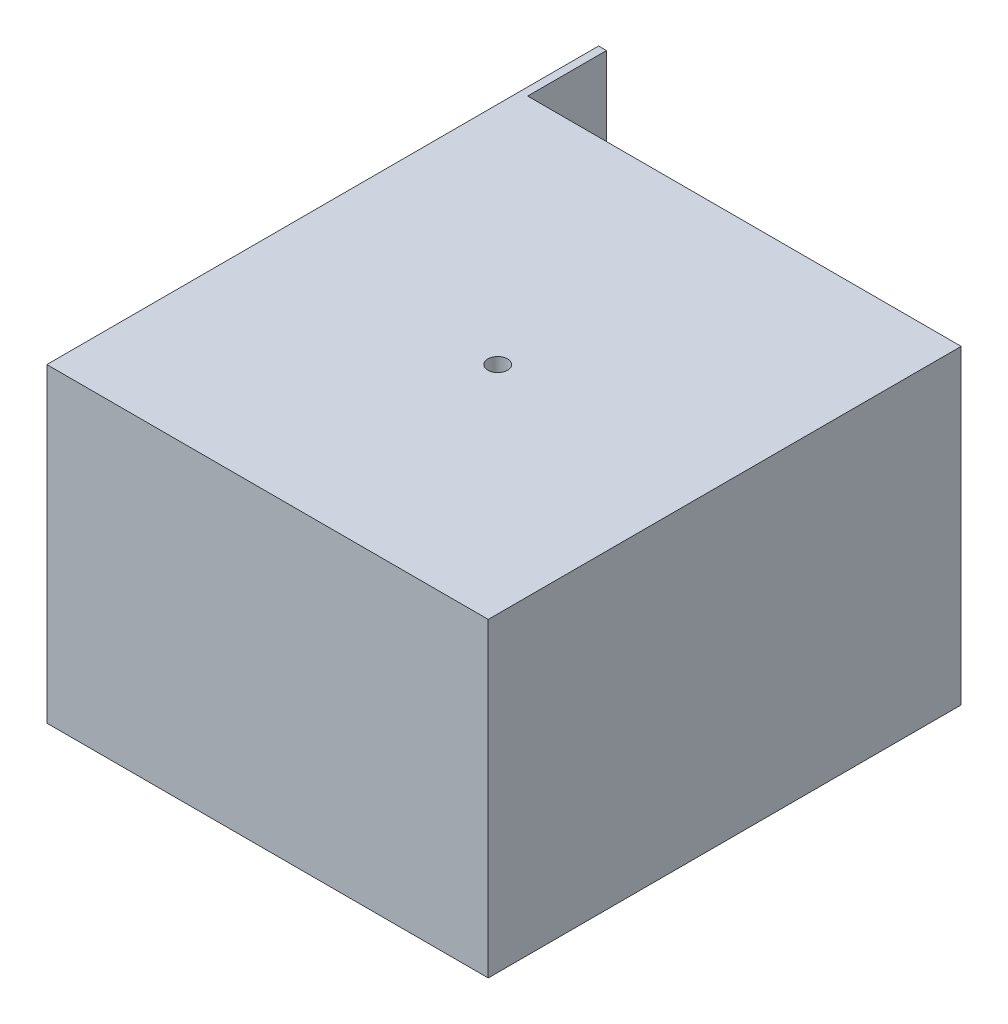
ISO-10303-21;
HEADER;
FILE_DESCRIPTION(('STEP AP214'),'2;1');
FILE_NAME('part.step','',(''),(''),'','','');
FILE_SCHEMA(('AUTOMOTIVE_DESIGN { 1 0 10303 214 1 1 1 1 }'));
ENDSEC;
DATA;
#1=APPLICATION_CONTEXT('core data for automotive mechanical design processes');
#2=APPLICATION_PROTOCOL_DEFINITION('international standard','automotive_design',2000,#1);
#3=PRODUCT_CONTEXT('',#1,'mechanical');
#4=PRODUCT('Part','Part','',(#3));
#5=PRODUCT_RELATED_PRODUCT_CATEGORY('part','',(#4));
#6=PRODUCT_DEFINITION_FORMATION('','',#4);
#7=PRODUCT_DEFINITION_CONTEXT('part definition',#1,'design');
#8=PRODUCT_DEFINITION('design','',#6,#7);
#9=PRODUCT_DEFINITION_SHAPE('','',#8);
#10=(LENGTH_UNIT() NAMED_UNIT(*) SI_UNIT(.MILLI.,.METRE.));
#11=(NAMED_UNIT(*) PLANE_ANGLE_UNIT() SI_UNIT($,.RADIAN.));
#12=(NAMED_UNIT(*) SI_UNIT($,.STERADIAN.) SOLID_ANGLE_UNIT());
#13=UNCERTAINTY_MEASURE_WITH_UNIT(LENGTH_MEASURE(1.E-05),#10,'distance_accuracy_value','');
#14=(GEOMETRIC_REPRESENTATION_CONTEXT(3) GLOBAL_UNCERTAINTY_ASSIGNED_CONTEXT((#13)) GLOBAL_UNIT_ASSIGNED_CONTEXT((#10,
#11,#12)) REPRESENTATION_CONTEXT('',''));
#15=CARTESIAN_POINT('',(0.,0.,0.));
#16=DIRECTION('',(0.,0.,1.));
#17=DIRECTION('',(1.,0.,0.));
#18=AXIS2_PLACEMENT_3D('',#15,#16,#17);
#19=CARTESIAN_POINT('',(-35.56,50.038,-38.1));
#20=DIRECTION('',(0.,0.,1.));
#21=DIRECTION('',(1.,0.,0.));
#22=AXIS2_PLACEMENT_3D('',#19,#20,#21);
#23=PLANE('',#22);
#24=DIRECTION('',(0.,-1.,0.));
#25=VECTOR('',#24,1.);
#26=CARTESIAN_POINT('',(-34.29,50.038,-38.1));
#27=LINE('',#26,#25);
#28=CARTESIAN_POINT('',(-34.29,50.038,-38.1));
#29=VERTEX_POINT('',#28);
#30=CARTESIAN_POINT('',(-34.29,0.,-38.1));
#31=VERTEX_POINT('',#30);
#32=EDGE_CURVE('E55',#29,#31,#27,.T.);
#33=ORIENTED_EDGE('',*,*,#32,.F.);
#34=DIRECTION('',(-1.,0.,0.));
#35=VECTOR('',#34,1.);
#36=CARTESIAN_POINT('',(-35.56,50.038,-38.1));
#37=LINE('',#36,#35);
#38=CARTESIAN_POINT('',(35.56,50.038,-38.1));
#39=VERTEX_POINT('',#38);
#40=EDGE_CURVE('E83',#39,#29,#37,.T.);
#41=ORIENTED_EDGE('',*,*,#40,.F.);
#42=DIRECTION('',(0.,-1.,0.));
#43=VECTOR('',#42,1.);
#44=CARTESIAN_POINT('',(35.56,50.038,-38.1));
#45=LINE('',#44,#43);
#46=CARTESIAN_POINT('',(35.56,0.,-38.1));
#47=VERTEX_POINT('',#46);
#48=EDGE_CURVE('E11',#39,#47,#45,.T.);
#49=ORIENTED_EDGE('',*,*,#48,.T.);
#50=DIRECTION('',(-1.,0.,0.));
#51=VECTOR('',#50,1.);
#52=CARTESIAN_POINT('',(-35.56,0.,-38.1));
#53=LINE('',#52,#51);
#54=EDGE_CURVE('E141',#47,#31,#53,.T.);
#55=ORIENTED_EDGE('',*,*,#54,.T.);
#56=EDGE_LOOP('',(#33,#41,#49,#55));
#57=FACE_BOUND('',#56,.T.);
#58=ADVANCED_FACE('F38',(#57),#23,.F.);
#59=CARTESIAN_POINT('',(35.56,50.038,38.1));
#60=DIRECTION('',(-1.,0.,0.));
#61=DIRECTION('',(0.,0.,1.));
#62=AXIS2_PLACEMENT_3D('',#59,#60,#61);
#63=PLANE('',#62);
#64=DIRECTION('',(0.,0.,-1.));
#65=VECTOR('',#64,1.);
#66=CARTESIAN_POINT('',(35.56,0.,38.1));
#67=LINE('',#66,#65);
#68=CARTESIAN_POINT('',(35.56,0.,38.1));
#69=VERTEX_POINT('',#68);
#70=EDGE_CURVE('E138',#69,#47,#67,.T.);
#71=ORIENTED_EDGE('',*,*,#70,.T.);
#72=ORIENTED_EDGE('',*,*,#48,.F.);
#73=DIRECTION('',(0.,0.,-1.));
#74=VECTOR('',#73,1.);
#75=CARTESIAN_POINT('',(35.56,50.038,38.1));
#76=LINE('',#75,#74);
#77=CARTESIAN_POINT('',(35.56,50.038,38.1));
#78=VERTEX_POINT('',#77);
#79=EDGE_CURVE('E130',#78,#39,#76,.T.);
#80=ORIENTED_EDGE('',*,*,#79,.F.);
#81=DIRECTION('',(0.,-1.,0.));
#82=VECTOR('',#81,1.);
#83=CARTESIAN_POINT('',(35.56,50.038,38.1));
#84=LINE('',#83,#82);
#85=EDGE_CURVE('E154',#78,#69,#84,.T.);
#86=ORIENTED_EDGE('',*,*,#85,.T.);
#87=EDGE_LOOP('',(#71,#72,#80,#86));
#88=FACE_BOUND('',#87,.T.);
#89=ADVANCED_FACE('F40',(#88),#63,.F.);
#90=CARTESIAN_POINT('',(-35.56,50.038,38.1));
#91=DIRECTION('',(1.,0.,0.));
#92=DIRECTION('',(0.,0.,-1.));
#93=AXIS2_PLACEMENT_3D('',#90,#91,#92);
#94=PLANE('',#93);
#95=DIRECTION('',(0.,0.,1.));
#96=VECTOR('',#95,1.);
#97=CARTESIAN_POINT('',(-35.56,0.,38.1));
#98=LINE('',#97,#96);
#99=CARTESIAN_POINT('',(-35.56,0.,-50.8));
#100=VERTEX_POINT('',#99);
#101=CARTESIAN_POINT('',(-35.56,0.,38.1));
#102=VERTEX_POINT('',#101);
#103=EDGE_CURVE('E146',#100,#102,#98,.T.);
#104=ORIENTED_EDGE('',*,*,#103,.T.);
#105=DIRECTION('',(0.,-1.,0.));
#106=VECTOR('',#105,1.);
#107=CARTESIAN_POINT('',(-35.56,50.038,38.1));
#108=LINE('',#107,#106);
#109=CARTESIAN_POINT('',(-35.56,50.038,38.1));
#110=VERTEX_POINT('',#109);
#111=EDGE_CURVE('E47',#110,#102,#108,.T.);
#112=ORIENTED_EDGE('',*,*,#111,.F.);
#113=DIRECTION('',(0.,0.,1.));
#114=VECTOR('',#113,1.);
#115=CARTESIAN_POINT('',(-35.56,50.038,38.1));
#116=LINE('',#115,#114);
#117=CARTESIAN_POINT('',(-35.56,50.038,-50.8));
#118=VERTEX_POINT('',#117);
#119=EDGE_CURVE('E100',#118,#110,#116,.T.);
#120=ORIENTED_EDGE('',*,*,#119,.F.);
#121=DIRECTION('',(0.,1.,0.));
#122=VECTOR('',#121,1.);
#123=CARTESIAN_POINT('',(-35.56,50.038,-50.8));
#124=LINE('',#123,#122);
#125=EDGE_CURVE('E104',#100,#118,#124,.T.);
#126=ORIENTED_EDGE('',*,*,#125,.F.);
#127=EDGE_LOOP('',(#104,#112,#120,#126));
#128=FACE_BOUND('',#127,.T.);
#129=ADVANCED_FACE('F102',(#128),#94,.F.);
#130=CARTESIAN_POINT('',(-35.56,50.038,38.1));
#131=DIRECTION('',(0.,0.,-1.));
#132=DIRECTION('',(-1.,0.,0.));
#133=AXIS2_PLACEMENT_3D('',#130,#131,#132);
#134=PLANE('',#133);
#135=DIRECTION('',(1.,0.,0.));
#136=VECTOR('',#135,1.);
#137=CARTESIAN_POINT('',(-35.56,0.,38.1));
#138=LINE('',#137,#136);
#139=EDGE_CURVE('E81',#102,#69,#138,.T.);
#140=ORIENTED_EDGE('',*,*,#139,.T.);
#141=ORIENTED_EDGE('',*,*,#85,.F.);
#142=DIRECTION('',(1.,0.,0.));
#143=VECTOR('',#142,1.);
#144=CARTESIAN_POINT('',(-35.56,50.038,38.1));
#145=LINE('',#144,#143);
#146=EDGE_CURVE('E64',#110,#78,#145,.T.);
#147=ORIENTED_EDGE('',*,*,#146,.F.);
#148=ORIENTED_EDGE('',*,*,#111,.T.);
#149=EDGE_LOOP('',(#140,#141,#147,#148));
#150=FACE_BOUND('',#149,.T.);
#151=ADVANCED_FACE('F156',(#150),#134,.F.);
#152=CARTESIAN_POINT('',(0.,50.038,0.));
#153=DIRECTION('',(0.,-1.,0.));
#154=DIRECTION('',(0.,0.,-1.));
#155=AXIS2_PLACEMENT_3D('',#152,#153,#154);
#156=PLANE('',#155);
#157=CARTESIAN_POINT('',(0.761999999999999,50.038,1.778));
#158=DIRECTION('',(0.,-1.,0.));
#159=DIRECTION('',(0.,0.,-1.));
#160=AXIS2_PLACEMENT_3D('',#157,#158,#159);
#161=CIRCLE('',#160,1.5875);
#162=CARTESIAN_POINT('',(0.761999999999999,50.038,0.190500000000002));
#163=VERTEX_POINT('',#162);
#164=EDGE_CURVE('E120',#163,#163,#161,.T.);
#165=ORIENTED_EDGE('',*,*,#164,.T.);
#166=EDGE_LOOP('',(#165));
#167=FACE_BOUND('',#166,.T.);
#168=ORIENTED_EDGE('',*,*,#79,.T.);
#169=ORIENTED_EDGE('',*,*,#40,.T.);
#170=DIRECTION('',(0.,0.,1.));
#171=VECTOR('',#170,1.);
#172=CARTESIAN_POINT('',(-34.29,50.038,-50.8));
#173=LINE('',#172,#171);
#174=CARTESIAN_POINT('',(-34.29,50.038,-50.8));
#175=VERTEX_POINT('',#174);
#176=EDGE_CURVE('E110',#175,#29,#173,.T.);
#177=ORIENTED_EDGE('',*,*,#176,.F.);
#178=DIRECTION('',(1.,0.,0.));
#179=VECTOR('',#178,1.);
#180=CARTESIAN_POINT('',(-35.56,50.038,-50.8));
#181=LINE('',#180,#179);
#182=EDGE_CURVE('E107',#118,#175,#181,.T.);
#183=ORIENTED_EDGE('',*,*,#182,.F.);
#184=ORIENTED_EDGE('',*,*,#119,.T.);
#185=ORIENTED_EDGE('',*,*,#146,.T.);
#186=EDGE_LOOP('',(#168,#169,#177,#183,#184,#185));
#187=FACE_BOUND('',#186,.T.);
#188=ADVANCED_FACE('F108',(#167,#187),#156,.F.);
#189=CARTESIAN_POINT('',(0.,0.,0.));
#190=DIRECTION('',(0.,-1.,0.));
#191=DIRECTION('',(0.,0.,-1.));
#192=AXIS2_PLACEMENT_3D('',#189,#190,#191);
#193=PLANE('',#192);
#194=CARTESIAN_POINT('',(0.761999999999999,0.,1.778));
#195=DIRECTION('',(0.,-1.,0.));
#196=DIRECTION('',(0.,0.,-1.));
#197=AXIS2_PLACEMENT_3D('',#194,#195,#196);
#198=CIRCLE('',#197,1.5875);
#199=CARTESIAN_POINT('',(0.761999999999999,0.,0.190500000000002));
#200=VERTEX_POINT('',#199);
#201=EDGE_CURVE('E192',#200,#200,#198,.T.);
#202=ORIENTED_EDGE('',*,*,#201,.F.);
#203=EDGE_LOOP('',(#202));
#204=FACE_BOUND('',#203,.T.);
#205=ORIENTED_EDGE('',*,*,#70,.F.);
#206=ORIENTED_EDGE('',*,*,#139,.F.);
#207=ORIENTED_EDGE('',*,*,#103,.F.);
#208=DIRECTION('',(-1.,0.,0.));
#209=VECTOR('',#208,1.);
#210=CARTESIAN_POINT('',(-35.56,0.,-50.8));
#211=LINE('',#210,#209);
#212=CARTESIAN_POINT('',(-34.29,0.,-50.8));
#213=VERTEX_POINT('',#212);
#214=EDGE_CURVE('E118',#213,#100,#211,.T.);
#215=ORIENTED_EDGE('',*,*,#214,.F.);
#216=DIRECTION('',(0.,0.,1.));
#217=VECTOR('',#216,1.);
#218=CARTESIAN_POINT('',(-34.29,0.,-50.8));
#219=LINE('',#218,#217);
#220=EDGE_CURVE('E127',#213,#31,#219,.T.);
#221=ORIENTED_EDGE('',*,*,#220,.T.);
#222=ORIENTED_EDGE('',*,*,#54,.F.);
#223=EDGE_LOOP('',(#205,#206,#207,#215,#221,#222));
#224=FACE_BOUND('',#223,.T.);
#225=ADVANCED_FACE('F157',(#204,#224),#193,.T.);
#226=CARTESIAN_POINT('',(-34.29,50.038,-50.8));
#227=DIRECTION('',(-1.,0.,0.));
#228=DIRECTION('',(0.,-1.,0.));
#229=AXIS2_PLACEMENT_3D('',#226,#227,#228);
#230=PLANE('',#229);
#231=ORIENTED_EDGE('',*,*,#32,.T.);
#232=ORIENTED_EDGE('',*,*,#220,.F.);
#233=DIRECTION('',(0.,-1.,0.));
#234=VECTOR('',#233,1.);
#235=CARTESIAN_POINT('',(-34.29,50.038,-50.8));
#236=LINE('',#235,#234);
#237=EDGE_CURVE('E113',#175,#213,#236,.T.);
#238=ORIENTED_EDGE('',*,*,#237,.F.);
#239=ORIENTED_EDGE('',*,*,#176,.T.);
#240=EDGE_LOOP('',(#231,#232,#238,#239));
#241=FACE_BOUND('',#240,.T.);
#242=ADVANCED_FACE('F175',(#241),#230,.F.);
#243=CARTESIAN_POINT('',(0.,0.,-50.8));
#244=DIRECTION('',(0.,0.,1.));
#245=DIRECTION('',(1.,0.,0.));
#246=AXIS2_PLACEMENT_3D('',#243,#244,#245);
#247=PLANE('',#246);
#248=ORIENTED_EDGE('',*,*,#125,.T.);
#249=ORIENTED_EDGE('',*,*,#182,.T.);
#250=ORIENTED_EDGE('',*,*,#237,.T.);
#251=ORIENTED_EDGE('',*,*,#214,.T.);
#252=EDGE_LOOP('',(#248,#249,#250,#251));
#253=FACE_BOUND('',#252,.T.);
#254=ADVANCED_FACE('F116',(#253),#247,.F.);
#255=CARTESIAN_POINT('',(0.761999999999999,50.03805,1.778));
#256=DIRECTION('',(0.,-1.,0.));
#257=DIRECTION('',(0.,0.,-1.));
#258=AXIS2_PLACEMENT_3D('',#255,#256,#257);
#259=CYLINDRICAL_SURFACE('',#258,1.5875);
#260=ORIENTED_EDGE('',*,*,#201,.T.);
#261=EDGE_LOOP('',(#260));
#262=FACE_BOUND('',#261,.T.);
#263=ORIENTED_EDGE('',*,*,#164,.F.);
#264=EDGE_LOOP('',(#263));
#265=FACE_BOUND('',#264,.T.);
#266=ADVANCED_FACE('F184',(#262,#265),#259,.F.);
#267=CLOSED_SHELL('',(#58,#89,#129,#151,#188,#225,#242,#254,#266));
#268=MANIFOLD_SOLID_BREP('B2',#267);
#269=ADVANCED_BREP_SHAPE_REPRESENTATION('',(#18,#268),#14);
#270=SHAPE_DEFINITION_REPRESENTATION(#9,#269);
ENDSEC;
END-ISO-10303-21;
